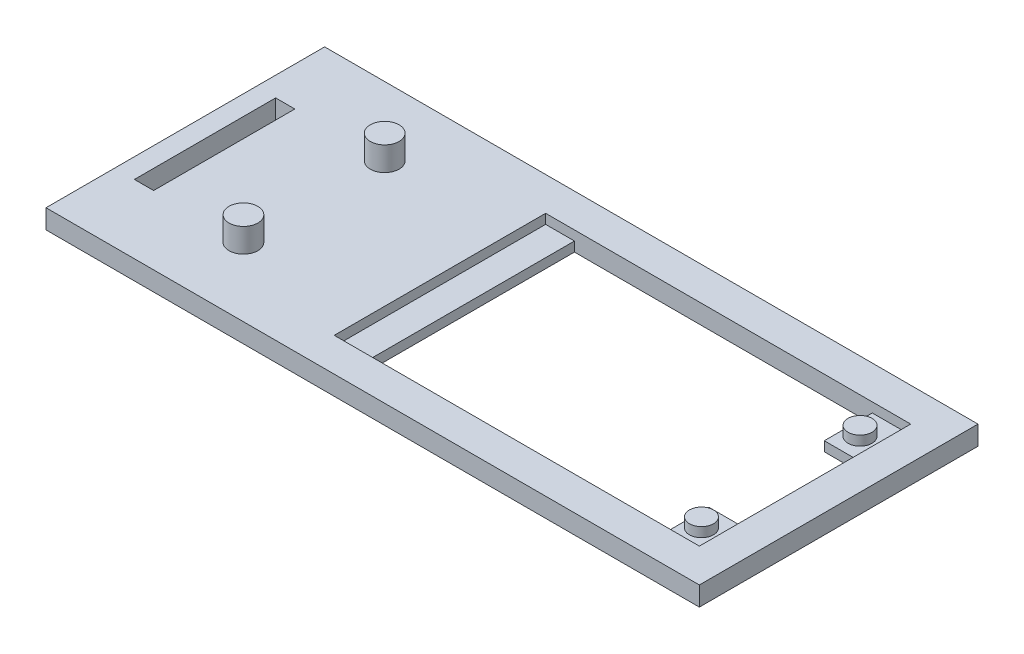
ISO-10303-21;
HEADER;
FILE_DESCRIPTION(('STEP AP214'),'2;1');
FILE_NAME('part.step','',(''),(''),'','','');
FILE_SCHEMA(('AUTOMOTIVE_DESIGN { 1 0 10303 214 1 1 1 1 }'));
ENDSEC;
DATA;
#1=APPLICATION_CONTEXT('core data for automotive mechanical design processes');
#2=APPLICATION_PROTOCOL_DEFINITION('international standard','automotive_design',2000,#1);
#3=PRODUCT_CONTEXT('',#1,'mechanical');
#4=PRODUCT('Part','Part','',(#3));
#5=PRODUCT_RELATED_PRODUCT_CATEGORY('part','',(#4));
#6=PRODUCT_DEFINITION_FORMATION('','',#4);
#7=PRODUCT_DEFINITION_CONTEXT('part definition',#1,'design');
#8=PRODUCT_DEFINITION('design','',#6,#7);
#9=PRODUCT_DEFINITION_SHAPE('','',#8);
#10=(LENGTH_UNIT() NAMED_UNIT(*) SI_UNIT(.MILLI.,.METRE.));
#11=(NAMED_UNIT(*) PLANE_ANGLE_UNIT() SI_UNIT($,.RADIAN.));
#12=(NAMED_UNIT(*) SI_UNIT($,.STERADIAN.) SOLID_ANGLE_UNIT());
#13=UNCERTAINTY_MEASURE_WITH_UNIT(LENGTH_MEASURE(1.E-05),#10,'distance_accuracy_value','');
#14=(GEOMETRIC_REPRESENTATION_CONTEXT(3) GLOBAL_UNCERTAINTY_ASSIGNED_CONTEXT((#13)) GLOBAL_UNIT_ASSIGNED_CONTEXT((#10,
#11,#12)) REPRESENTATION_CONTEXT('',''));
#15=CARTESIAN_POINT('',(0.,0.,0.));
#16=DIRECTION('',(0.,0.,1.));
#17=DIRECTION('',(1.,0.,0.));
#18=AXIS2_PLACEMENT_3D('',#15,#16,#17);
#19=CARTESIAN_POINT('',(0.,1.,0.));
#20=DIRECTION('',(0.,1.,0.));
#21=DIRECTION('',(0.,0.,1.));
#22=AXIS2_PLACEMENT_3D('',#19,#20,#21);
#23=PLANE('',#22);
#24=CARTESIAN_POINT('',(34.4148716728796,1.,-10.8055555555556));
#25=DIRECTION('',(0.,1.,0.));
#26=DIRECTION('',(0.,0.,1.));
#27=AXIS2_PLACEMENT_3D('',#24,#25,#26);
#28=CIRCLE('',#27,1.25);
#29=CARTESIAN_POINT('',(34.4148716728796,1.,-9.55555555555556));
#30=VERTEX_POINT('',#29);
#31=EDGE_CURVE('E199',#30,#30,#28,.T.);
#32=ORIENTED_EDGE('',*,*,#31,.F.);
#33=EDGE_LOOP('',(#32));
#34=FACE_BOUND('',#33,.T.);
#35=DIRECTION('',(-1.,0.,0.));
#36=VECTOR('',#35,1.);
#37=CARTESIAN_POINT('',(32.9444444444444,1.,-8.55555555555555));
#38=LINE('',#37,#36);
#39=CARTESIAN_POINT('',(36.9444444444444,1.,-8.55555555555555));
#40=VERTEX_POINT('',#39);
#41=CARTESIAN_POINT('',(32.9444444444444,1.,-8.55555555555555));
#42=VERTEX_POINT('',#41);
#43=EDGE_CURVE('E195',#40,#42,#38,.T.);
#44=ORIENTED_EDGE('',*,*,#43,.F.);
#45=DIRECTION('',(0.,0.,-1.));
#46=VECTOR('',#45,1.);
#47=CARTESIAN_POINT('',(36.9444444444444,1.,-13.5555555555556));
#48=LINE('',#47,#46);
#49=CARTESIAN_POINT('',(36.9444444444444,1.,-13.5555555555556));
#50=VERTEX_POINT('',#49);
#51=EDGE_CURVE('E243',#40,#50,#48,.T.);
#52=ORIENTED_EDGE('',*,*,#51,.T.);
#53=DIRECTION('',(-1.,0.,0.));
#54=VECTOR('',#53,1.);
#55=CARTESIAN_POINT('',(-1.05555555555555,1.,-13.5555555555556));
#56=LINE('',#55,#54);
#57=CARTESIAN_POINT('',(32.9444444444444,1.,-13.5555555555556));
#58=VERTEX_POINT('',#57);
#59=EDGE_CURVE('E247',#50,#58,#56,.T.);
#60=ORIENTED_EDGE('',*,*,#59,.T.);
#61=DIRECTION('',(0.,0.,-1.));
#62=VECTOR('',#61,1.);
#63=CARTESIAN_POINT('',(32.9444444444444,1.,-13.5555555555556));
#64=LINE('',#63,#62);
#65=EDGE_CURVE('E225',#42,#58,#64,.T.);
#66=ORIENTED_EDGE('',*,*,#65,.F.);
#67=EDGE_LOOP('',(#44,#52,#60,#66));
#68=FACE_BOUND('',#67,.T.);
#69=ADVANCED_FACE('F33',(#34,#68),#23,.T.);
#70=CARTESIAN_POINT('',(32.9444444444444,0.,-13.5555555555556));
#71=DIRECTION('',(1.,0.,0.));
#72=DIRECTION('',(0.,0.,-1.));
#73=AXIS2_PLACEMENT_3D('',#70,#71,#72);
#74=PLANE('',#73);
#75=DIRECTION('',(0.,0.,-1.));
#76=VECTOR('',#75,1.);
#77=CARTESIAN_POINT('',(32.9444444444444,0.,-13.5555555555556));
#78=LINE('',#77,#76);
#79=CARTESIAN_POINT('',(32.9444444444444,0.,-8.55555555555555));
#80=VERTEX_POINT('',#79);
#81=CARTESIAN_POINT('',(32.9444444444444,0.,-13.5555555555556));
#82=VERTEX_POINT('',#81);
#83=EDGE_CURVE('E217',#80,#82,#78,.T.);
#84=ORIENTED_EDGE('',*,*,#83,.F.);
#85=DIRECTION('',(0.,1.,0.));
#86=VECTOR('',#85,1.);
#87=CARTESIAN_POINT('',(32.9444444444444,0.,-8.55555555555555));
#88=LINE('',#87,#86);
#89=EDGE_CURVE('E205',#80,#42,#88,.T.);
#90=ORIENTED_EDGE('',*,*,#89,.T.);
#91=ORIENTED_EDGE('',*,*,#65,.T.);
#92=DIRECTION('',(0.,1.,0.));
#93=VECTOR('',#92,1.);
#94=CARTESIAN_POINT('',(32.9444444444444,0.,-13.5555555555556));
#95=LINE('',#94,#93);
#96=EDGE_CURVE('E230',#82,#58,#95,.T.);
#97=ORIENTED_EDGE('',*,*,#96,.F.);
#98=EDGE_LOOP('',(#84,#90,#91,#97));
#99=FACE_BOUND('',#98,.T.);
#100=ADVANCED_FACE('F368',(#99),#74,.F.);
#101=DIRECTION('',(0.,0.,1.));
#102=VECTOR('',#101,1.);
#103=CARTESIAN_POINT('',(1.94444444444445,1.,-13.5555555555556));
#104=LINE('',#103,#102);
#105=CARTESIAN_POINT('',(1.94444444444445,1.,-13.5555555555556));
#106=VERTEX_POINT('',#105);
#107=CARTESIAN_POINT('',(1.94444444444445,1.,8.44444444444444));
#108=VERTEX_POINT('',#107);
#109=EDGE_CURVE('E208',#106,#108,#104,.T.);
#110=ORIENTED_EDGE('',*,*,#109,.F.);
#111=CARTESIAN_POINT('',(-1.05555555555555,1.,-13.5555555555556));
#112=VERTEX_POINT('',#111);
#113=EDGE_CURVE('E246',#106,#112,#56,.T.);
#114=ORIENTED_EDGE('',*,*,#113,.T.);
#115=DIRECTION('',(0.,0.,1.));
#116=VECTOR('',#115,1.);
#117=CARTESIAN_POINT('',(-1.05555555555555,1.,-13.5555555555556));
#118=LINE('',#117,#116);
#119=CARTESIAN_POINT('',(-1.05555555555555,1.,8.44444444444444));
#120=VERTEX_POINT('',#119);
#121=EDGE_CURVE('E235',#112,#120,#118,.T.);
#122=ORIENTED_EDGE('',*,*,#121,.T.);
#123=DIRECTION('',(1.,0.,0.));
#124=VECTOR('',#123,1.);
#125=CARTESIAN_POINT('',(-1.05555555555555,1.,8.44444444444444));
#126=LINE('',#125,#124);
#127=EDGE_CURVE('E240',#120,#108,#126,.T.);
#128=ORIENTED_EDGE('',*,*,#127,.T.);
#129=EDGE_LOOP('',(#110,#114,#122,#128));
#130=FACE_BOUND('',#129,.T.);
#131=ADVANCED_FACE('F371',(#130),#23,.T.);
#132=CARTESIAN_POINT('',(-27.5555555555556,2.,-17.0555555555556));
#133=DIRECTION('',(1.,0.,0.));
#134=DIRECTION('',(0.,0.,-1.));
#135=AXIS2_PLACEMENT_3D('',#132,#133,#134);
#136=PLANE('',#135);
#137=DIRECTION('',(0.,0.,1.));
#138=VECTOR('',#137,1.);
#139=CARTESIAN_POINT('',(-27.5555555555556,0.,-17.0555555555556));
#140=LINE('',#139,#138);
#141=CARTESIAN_POINT('',(-27.5555555555556,0.,-17.0555555555556));
#142=VERTEX_POINT('',#141);
#143=CARTESIAN_POINT('',(-27.5555555555555,0.,11.9444444444444));
#144=VERTEX_POINT('',#143);
#145=EDGE_CURVE('E297',#142,#144,#140,.T.);
#146=ORIENTED_EDGE('',*,*,#145,.T.);
#147=DIRECTION('',(0.,-1.,0.));
#148=VECTOR('',#147,1.);
#149=CARTESIAN_POINT('',(-27.5555555555555,2.,11.9444444444444));
#150=LINE('',#149,#148);
#151=CARTESIAN_POINT('',(-27.5555555555555,2.,11.9444444444444));
#152=VERTEX_POINT('',#151);
#153=EDGE_CURVE('E326',#152,#144,#150,.T.);
#154=ORIENTED_EDGE('',*,*,#153,.F.);
#155=DIRECTION('',(0.,0.,1.));
#156=VECTOR('',#155,1.);
#157=CARTESIAN_POINT('',(-27.5555555555556,2.,-17.0555555555556));
#158=LINE('',#157,#156);
#159=CARTESIAN_POINT('',(-27.5555555555556,2.,-17.0555555555556));
#160=VERTEX_POINT('',#159);
#161=EDGE_CURVE('E300',#160,#152,#158,.T.);
#162=ORIENTED_EDGE('',*,*,#161,.F.);
#163=DIRECTION('',(0.,-1.,0.));
#164=VECTOR('',#163,1.);
#165=CARTESIAN_POINT('',(-27.5555555555556,2.,-17.0555555555556));
#166=LINE('',#165,#164);
#167=EDGE_CURVE('E310',#160,#142,#166,.T.);
#168=ORIENTED_EDGE('',*,*,#167,.T.);
#169=EDGE_LOOP('',(#146,#154,#162,#168));
#170=FACE_BOUND('',#169,.T.);
#171=ADVANCED_FACE('F35',(#170),#136,.F.);
#172=CARTESIAN_POINT('',(-27.5555555555555,2.,11.9444444444444));
#173=DIRECTION('',(0.,0.,-1.));
#174=DIRECTION('',(-1.,0.,0.));
#175=AXIS2_PLACEMENT_3D('',#172,#173,#174);
#176=PLANE('',#175);
#177=DIRECTION('',(1.,0.,0.));
#178=VECTOR('',#177,1.);
#179=CARTESIAN_POINT('',(-27.5555555555555,0.,11.9444444444444));
#180=LINE('',#179,#178);
#181=CARTESIAN_POINT('',(40.4444444444444,0.,11.9444444444444));
#182=VERTEX_POINT('',#181);
#183=EDGE_CURVE('E313',#144,#182,#180,.T.);
#184=ORIENTED_EDGE('',*,*,#183,.T.);
#185=DIRECTION('',(0.,-1.,0.));
#186=VECTOR('',#185,1.);
#187=CARTESIAN_POINT('',(40.4444444444444,2.,11.9444444444444));
#188=LINE('',#187,#186);
#189=CARTESIAN_POINT('',(40.4444444444444,2.,11.9444444444444));
#190=VERTEX_POINT('',#189);
#191=EDGE_CURVE('E323',#190,#182,#188,.T.);
#192=ORIENTED_EDGE('',*,*,#191,.F.);
#193=DIRECTION('',(1.,0.,0.));
#194=VECTOR('',#193,1.);
#195=CARTESIAN_POINT('',(-27.5555555555555,2.,11.9444444444444));
#196=LINE('',#195,#194);
#197=EDGE_CURVE('E303',#152,#190,#196,.T.);
#198=ORIENTED_EDGE('',*,*,#197,.F.);
#199=ORIENTED_EDGE('',*,*,#153,.T.);
#200=EDGE_LOOP('',(#184,#192,#198,#199));
#201=FACE_BOUND('',#200,.T.);
#202=ADVANCED_FACE('F641',(#201),#176,.F.);
#203=CARTESIAN_POINT('',(40.4444444444445,2.,-17.0555555555556));
#204=DIRECTION('',(-1.,0.,0.));
#205=DIRECTION('',(0.,0.,1.));
#206=AXIS2_PLACEMENT_3D('',#203,#204,#205);
#207=PLANE('',#206);
#208=DIRECTION('',(0.,0.,-1.));
#209=VECTOR('',#208,1.);
#210=CARTESIAN_POINT('',(40.4444444444445,0.,-17.0555555555556));
#211=LINE('',#210,#209);
#212=CARTESIAN_POINT('',(40.4444444444445,0.,-17.0555555555556));
#213=VERTEX_POINT('',#212);
#214=EDGE_CURVE('E315',#182,#213,#211,.T.);
#215=ORIENTED_EDGE('',*,*,#214,.T.);
#216=DIRECTION('',(0.,-1.,0.));
#217=VECTOR('',#216,1.);
#218=CARTESIAN_POINT('',(40.4444444444445,2.,-17.0555555555556));
#219=LINE('',#218,#217);
#220=CARTESIAN_POINT('',(40.4444444444445,2.,-17.0555555555556));
#221=VERTEX_POINT('',#220);
#222=EDGE_CURVE('E320',#221,#213,#219,.T.);
#223=ORIENTED_EDGE('',*,*,#222,.F.);
#224=DIRECTION('',(0.,0.,-1.));
#225=VECTOR('',#224,1.);
#226=CARTESIAN_POINT('',(40.4444444444445,2.,-17.0555555555556));
#227=LINE('',#226,#225);
#228=EDGE_CURVE('E306',#190,#221,#227,.T.);
#229=ORIENTED_EDGE('',*,*,#228,.F.);
#230=ORIENTED_EDGE('',*,*,#191,.T.);
#231=EDGE_LOOP('',(#215,#223,#229,#230));
#232=FACE_BOUND('',#231,.T.);
#233=ADVANCED_FACE('F631',(#232),#207,.F.);
#234=CARTESIAN_POINT('',(-27.5555555555556,2.,-17.0555555555556));
#235=DIRECTION('',(0.,0.,1.));
#236=DIRECTION('',(1.,0.,0.));
#237=AXIS2_PLACEMENT_3D('',#234,#235,#236);
#238=PLANE('',#237);
#239=DIRECTION('',(-1.,0.,0.));
#240=VECTOR('',#239,1.);
#241=CARTESIAN_POINT('',(-27.5555555555556,0.,-17.0555555555556));
#242=LINE('',#241,#240);
#243=EDGE_CURVE('E304',#213,#142,#242,.T.);
#244=ORIENTED_EDGE('',*,*,#243,.T.);
#245=ORIENTED_EDGE('',*,*,#167,.F.);
#246=DIRECTION('',(-1.,0.,0.));
#247=VECTOR('',#246,1.);
#248=CARTESIAN_POINT('',(-27.5555555555556,2.,-17.0555555555556));
#249=LINE('',#248,#247);
#250=EDGE_CURVE('E308',#221,#160,#249,.T.);
#251=ORIENTED_EDGE('',*,*,#250,.F.);
#252=ORIENTED_EDGE('',*,*,#222,.T.);
#253=EDGE_LOOP('',(#244,#245,#251,#252));
#254=FACE_BOUND('',#253,.T.);
#255=ADVANCED_FACE('F560',(#254),#238,.F.);
#256=CARTESIAN_POINT('',(0.,2.,0.));
#257=DIRECTION('',(0.,1.,0.));
#258=DIRECTION('',(0.,0.,1.));
#259=AXIS2_PLACEMENT_3D('',#256,#257,#258);
#260=PLANE('',#259);
#261=DIRECTION('',(0.,0.,1.));
#262=VECTOR('',#261,1.);
#263=CARTESIAN_POINT('',(-1.05555555555555,2.,-13.5555555555556));
#264=LINE('',#263,#262);
#265=CARTESIAN_POINT('',(-1.05555555555555,2.,-13.5555555555556));
#266=VERTEX_POINT('',#265);
#267=CARTESIAN_POINT('',(-1.05555555555555,2.,8.44444444444444));
#268=VERTEX_POINT('',#267);
#269=EDGE_CURVE('E229',#266,#268,#264,.T.);
#270=ORIENTED_EDGE('',*,*,#269,.F.);
#271=DIRECTION('',(-1.,0.,0.));
#272=VECTOR('',#271,1.);
#273=CARTESIAN_POINT('',(-1.05555555555555,2.,-13.5555555555556));
#274=LINE('',#273,#272);
#275=CARTESIAN_POINT('',(36.9444444444444,2.,-13.5555555555556));
#276=VERTEX_POINT('',#275);
#277=EDGE_CURVE('E239',#276,#266,#274,.T.);
#278=ORIENTED_EDGE('',*,*,#277,.F.);
#279=DIRECTION('',(0.,0.,-1.));
#280=VECTOR('',#279,1.);
#281=CARTESIAN_POINT('',(36.9444444444444,2.,-13.5555555555556));
#282=LINE('',#281,#280);
#283=CARTESIAN_POINT('',(36.9444444444444,2.,8.44444444444444));
#284=VERTEX_POINT('',#283);
#285=EDGE_CURVE('E255',#284,#276,#282,.T.);
#286=ORIENTED_EDGE('',*,*,#285,.F.);
#287=DIRECTION('',(1.,0.,0.));
#288=VECTOR('',#287,1.);
#289=CARTESIAN_POINT('',(-1.05555555555555,2.,8.44444444444444));
#290=LINE('',#289,#288);
#291=EDGE_CURVE('E252',#268,#284,#290,.T.);
#292=ORIENTED_EDGE('',*,*,#291,.F.);
#293=EDGE_LOOP('',(#270,#278,#286,#292));
#294=FACE_BOUND('',#293,.T.);
#295=DIRECTION('',(0.,0.,1.));
#296=VECTOR('',#295,1.);
#297=CARTESIAN_POINT('',(-25.5055555555555,2.,-9.90555555555555));
#298=LINE('',#297,#296);
#299=CARTESIAN_POINT('',(-25.5055555555555,2.,-9.90555555555555));
#300=VERTEX_POINT('',#299);
#301=CARTESIAN_POINT('',(-25.5055555555555,2.,4.79444444444445));
#302=VERTEX_POINT('',#301);
#303=EDGE_CURVE('E261',#300,#302,#298,.T.);
#304=ORIENTED_EDGE('',*,*,#303,.F.);
#305=DIRECTION('',(-1.,0.,0.));
#306=VECTOR('',#305,1.);
#307=CARTESIAN_POINT('',(-25.5055555555555,2.,-9.90555555555555));
#308=LINE('',#307,#306);
#309=CARTESIAN_POINT('',(-23.5055555555555,2.,-9.90555555555555));
#310=VERTEX_POINT('',#309);
#311=EDGE_CURVE('E275',#310,#300,#308,.T.);
#312=ORIENTED_EDGE('',*,*,#311,.F.);
#313=DIRECTION('',(0.,0.,-1.));
#314=VECTOR('',#313,1.);
#315=CARTESIAN_POINT('',(-23.5055555555555,2.,-9.90555555555555));
#316=LINE('',#315,#314);
#317=CARTESIAN_POINT('',(-23.5055555555555,2.,4.79444444444445));
#318=VERTEX_POINT('',#317);
#319=EDGE_CURVE('E272',#318,#310,#316,.T.);
#320=ORIENTED_EDGE('',*,*,#319,.F.);
#321=DIRECTION('',(1.,0.,0.));
#322=VECTOR('',#321,1.);
#323=CARTESIAN_POINT('',(-25.5055555555555,2.,4.79444444444445));
#324=LINE('',#323,#322);
#325=EDGE_CURVE('E269',#302,#318,#324,.T.);
#326=ORIENTED_EDGE('',*,*,#325,.F.);
#327=EDGE_LOOP('',(#304,#312,#320,#326));
#328=FACE_BOUND('',#327,.T.);
#329=CARTESIAN_POINT('',(-14.1555555555555,2.,-9.90555555555555));
#330=DIRECTION('',(0.,1.,0.));
#331=DIRECTION('',(0.,0.,1.));
#332=AXIS2_PLACEMENT_3D('',#329,#330,#331);
#333=CIRCLE('',#332,1.5);
#334=CARTESIAN_POINT('',(-14.1555555555555,2.,-8.40555555555555));
#335=VERTEX_POINT('',#334);
#336=EDGE_CURVE('E281',#335,#335,#333,.T.);
#337=ORIENTED_EDGE('',*,*,#336,.F.);
#338=EDGE_LOOP('',(#337));
#339=FACE_BOUND('',#338,.T.);
#340=CARTESIAN_POINT('',(-14.1555555555555,2.,4.79444444444445));
#341=DIRECTION('',(0.,1.,0.));
#342=DIRECTION('',(0.,0.,1.));
#343=AXIS2_PLACEMENT_3D('',#340,#341,#342);
#344=CIRCLE('',#343,1.5);
#345=CARTESIAN_POINT('',(-14.1555555555555,2.,6.29444444444445));
#346=VERTEX_POINT('',#345);
#347=EDGE_CURVE('E291',#346,#346,#344,.T.);
#348=ORIENTED_EDGE('',*,*,#347,.F.);
#349=EDGE_LOOP('',(#348));
#350=FACE_BOUND('',#349,.T.);
#351=ORIENTED_EDGE('',*,*,#161,.T.);
#352=ORIENTED_EDGE('',*,*,#197,.T.);
#353=ORIENTED_EDGE('',*,*,#228,.T.);
#354=ORIENTED_EDGE('',*,*,#250,.T.);
#355=EDGE_LOOP('',(#351,#352,#353,#354));
#356=FACE_BOUND('',#355,.T.);
#357=ADVANCED_FACE('F348',(#294,#328,#339,#350,#356),#260,.T.);
#358=CARTESIAN_POINT('',(0.,0.,0.));
#359=DIRECTION('',(0.,1.,0.));
#360=DIRECTION('',(0.,0.,1.));
#361=AXIS2_PLACEMENT_3D('',#358,#359,#360);
#362=PLANE('',#361);
#363=DIRECTION('',(0.,0.,-1.));
#364=VECTOR('',#363,1.);
#365=CARTESIAN_POINT('',(36.9444444444444,0.,-8.55555555555555));
#366=LINE('',#365,#364);
#367=CARTESIAN_POINT('',(36.9444444444444,0.,3.44444444444445));
#368=VERTEX_POINT('',#367);
#369=CARTESIAN_POINT('',(36.9444444444444,0.,-8.55555555555555));
#370=VERTEX_POINT('',#369);
#371=EDGE_CURVE('E181',#368,#370,#366,.T.);
#372=ORIENTED_EDGE('',*,*,#371,.T.);
#373=DIRECTION('',(-1.,0.,0.));
#374=VECTOR('',#373,1.);
#375=CARTESIAN_POINT('',(32.9444444444444,0.,-8.55555555555555));
#376=LINE('',#375,#374);
#377=EDGE_CURVE('E188',#370,#80,#376,.T.);
#378=ORIENTED_EDGE('',*,*,#377,.T.);
#379=ORIENTED_EDGE('',*,*,#83,.T.);
#380=DIRECTION('',(-1.,0.,0.));
#381=VECTOR('',#380,1.);
#382=CARTESIAN_POINT('',(1.94444444444445,0.,-13.5555555555556));
#383=LINE('',#382,#381);
#384=CARTESIAN_POINT('',(1.94444444444445,0.,-13.5555555555556));
#385=VERTEX_POINT('',#384);
#386=EDGE_CURVE('E219',#82,#385,#383,.T.);
#387=ORIENTED_EDGE('',*,*,#386,.T.);
#388=DIRECTION('',(0.,0.,1.));
#389=VECTOR('',#388,1.);
#390=CARTESIAN_POINT('',(1.94444444444445,0.,-13.5555555555556));
#391=LINE('',#390,#389);
#392=CARTESIAN_POINT('',(1.94444444444445,0.,8.44444444444444));
#393=VERTEX_POINT('',#392);
#394=EDGE_CURVE('E211',#385,#393,#391,.T.);
#395=ORIENTED_EDGE('',*,*,#394,.T.);
#396=DIRECTION('',(1.,0.,0.));
#397=VECTOR('',#396,1.);
#398=CARTESIAN_POINT('',(1.94444444444445,0.,8.44444444444444));
#399=LINE('',#398,#397);
#400=CARTESIAN_POINT('',(32.9444444444444,0.,8.44444444444444));
#401=VERTEX_POINT('',#400);
#402=EDGE_CURVE('E214',#393,#401,#399,.T.);
#403=ORIENTED_EDGE('',*,*,#402,.T.);
#404=CARTESIAN_POINT('',(32.9444444444444,0.,3.44444444444444));
#405=VERTEX_POINT('',#404);
#406=EDGE_CURVE('E194',#401,#405,#78,.T.);
#407=ORIENTED_EDGE('',*,*,#406,.T.);
#408=DIRECTION('',(1.,0.,0.));
#409=VECTOR('',#408,1.);
#410=CARTESIAN_POINT('',(32.9444444444444,0.,3.44444444444445));
#411=LINE('',#410,#409);
#412=EDGE_CURVE('E48',#405,#368,#411,.T.);
#413=ORIENTED_EDGE('',*,*,#412,.T.);
#414=EDGE_LOOP('',(#372,#378,#379,#387,#395,#403,#407,#413));
#415=FACE_BOUND('',#414,.T.);
#416=DIRECTION('',(-1.,0.,0.));
#417=VECTOR('',#416,1.);
#418=CARTESIAN_POINT('',(0.,0.,-9.90555555555555));
#419=LINE('',#418,#417);
#420=CARTESIAN_POINT('',(-23.5055555555555,0.,-9.90555555555555));
#421=VERTEX_POINT('',#420);
#422=CARTESIAN_POINT('',(-25.5055555555555,0.,-9.90555555555555));
#423=VERTEX_POINT('',#422);
#424=EDGE_CURVE('E41',#421,#423,#419,.T.);
#425=ORIENTED_EDGE('',*,*,#424,.T.);
#426=DIRECTION('',(0.,0.,1.));
#427=VECTOR('',#426,1.);
#428=CARTESIAN_POINT('',(-25.5055555555555,0.,0.));
#429=LINE('',#428,#427);
#430=CARTESIAN_POINT('',(-25.5055555555555,0.,4.79444444444445));
#431=VERTEX_POINT('',#430);
#432=EDGE_CURVE('E11',#423,#431,#429,.T.);
#433=ORIENTED_EDGE('',*,*,#432,.T.);
#434=DIRECTION('',(1.,0.,0.));
#435=VECTOR('',#434,1.);
#436=CARTESIAN_POINT('',(0.,0.,4.79444444444445));
#437=LINE('',#436,#435);
#438=CARTESIAN_POINT('',(-23.5055555555555,0.,4.79444444444445));
#439=VERTEX_POINT('',#438);
#440=EDGE_CURVE('E329',#431,#439,#437,.T.);
#441=ORIENTED_EDGE('',*,*,#440,.T.);
#442=DIRECTION('',(0.,0.,-1.));
#443=VECTOR('',#442,1.);
#444=CARTESIAN_POINT('',(-23.5055555555555,0.,0.));
#445=LINE('',#444,#443);
#446=EDGE_CURVE('E332',#439,#421,#445,.T.);
#447=ORIENTED_EDGE('',*,*,#446,.T.);
#448=EDGE_LOOP('',(#425,#433,#441,#447));
#449=FACE_BOUND('',#448,.T.);
#450=ORIENTED_EDGE('',*,*,#145,.F.);
#451=ORIENTED_EDGE('',*,*,#243,.F.);
#452=ORIENTED_EDGE('',*,*,#214,.F.);
#453=ORIENTED_EDGE('',*,*,#183,.F.);
#454=EDGE_LOOP('',(#450,#451,#452,#453));
#455=FACE_BOUND('',#454,.T.);
#456=ADVANCED_FACE('F191',(#415,#449,#455),#362,.F.);
#457=CARTESIAN_POINT('',(-14.1555555555555,4.5,4.79444444444445));
#458=DIRECTION('',(0.,-1.,0.));
#459=DIRECTION('',(0.,0.,-1.));
#460=AXIS2_PLACEMENT_3D('',#457,#458,#459);
#461=CYLINDRICAL_SURFACE('',#460,1.5);
#462=CARTESIAN_POINT('',(-14.1555555555555,4.5,4.79444444444445));
#463=DIRECTION('',(0.,1.,0.));
#464=DIRECTION('',(0.,0.,1.));
#465=AXIS2_PLACEMENT_3D('',#462,#463,#464);
#466=CIRCLE('',#465,1.5);
#467=CARTESIAN_POINT('',(-14.1555555555555,4.5,6.29444444444445));
#468=VERTEX_POINT('',#467);
#469=EDGE_CURVE('E294',#468,#468,#466,.T.);
#470=ORIENTED_EDGE('',*,*,#469,.F.);
#471=EDGE_LOOP('',(#470));
#472=FACE_BOUND('',#471,.T.);
#473=ORIENTED_EDGE('',*,*,#347,.T.);
#474=EDGE_LOOP('',(#473));
#475=FACE_BOUND('',#474,.T.);
#476=ADVANCED_FACE('F536',(#472,#475),#461,.T.);
#477=CARTESIAN_POINT('',(-14.1555555555555,4.5,4.79444444444445));
#478=DIRECTION('',(0.,1.,0.));
#479=DIRECTION('',(0.,0.,1.));
#480=AXIS2_PLACEMENT_3D('',#477,#478,#479);
#481=PLANE('',#480);
#482=ORIENTED_EDGE('',*,*,#469,.T.);
#483=EDGE_LOOP('',(#482));
#484=FACE_BOUND('',#483,.T.);
#485=ADVANCED_FACE('F607',(#484),#481,.T.);
#486=CARTESIAN_POINT('',(-14.1555555555555,4.5,-9.90555555555555));
#487=DIRECTION('',(0.,-1.,0.));
#488=DIRECTION('',(0.,0.,-1.));
#489=AXIS2_PLACEMENT_3D('',#486,#487,#488);
#490=CYLINDRICAL_SURFACE('',#489,1.5);
#491=CARTESIAN_POINT('',(-14.1555555555555,4.5,-9.90555555555555));
#492=DIRECTION('',(0.,1.,0.));
#493=DIRECTION('',(0.,0.,1.));
#494=AXIS2_PLACEMENT_3D('',#491,#492,#493);
#495=CIRCLE('',#494,1.5);
#496=CARTESIAN_POINT('',(-14.1555555555555,4.5,-8.40555555555555));
#497=VERTEX_POINT('',#496);
#498=EDGE_CURVE('E288',#497,#497,#495,.T.);
#499=ORIENTED_EDGE('',*,*,#498,.F.);
#500=EDGE_LOOP('',(#499));
#501=FACE_BOUND('',#500,.T.);
#502=ORIENTED_EDGE('',*,*,#336,.T.);
#503=EDGE_LOOP('',(#502));
#504=FACE_BOUND('',#503,.T.);
#505=ADVANCED_FACE('F597',(#501,#504),#490,.T.);
#506=CARTESIAN_POINT('',(-14.1555555555555,4.5,-9.90555555555555));
#507=DIRECTION('',(0.,1.,0.));
#508=DIRECTION('',(0.,0.,1.));
#509=AXIS2_PLACEMENT_3D('',#506,#507,#508);
#510=PLANE('',#509);
#511=ORIENTED_EDGE('',*,*,#498,.T.);
#512=EDGE_LOOP('',(#511));
#513=FACE_BOUND('',#512,.T.);
#514=ADVANCED_FACE('F589',(#513),#510,.T.);
#515=CARTESIAN_POINT('',(-25.5055555555555,-0.5,-9.90555555555555));
#516=DIRECTION('',(-1.,0.,0.));
#517=DIRECTION('',(0.,0.,1.));
#518=AXIS2_PLACEMENT_3D('',#515,#516,#517);
#519=PLANE('',#518);
#520=DIRECTION('',(0.,1.,0.));
#521=VECTOR('',#520,1.);
#522=CARTESIAN_POINT('',(-25.5055555555555,-0.5,-9.90555555555555));
#523=LINE('',#522,#521);
#524=EDGE_CURVE('E279',#423,#300,#523,.T.);
#525=ORIENTED_EDGE('',*,*,#524,.T.);
#526=ORIENTED_EDGE('',*,*,#303,.T.);
#527=DIRECTION('',(0.,1.,0.));
#528=VECTOR('',#527,1.);
#529=CARTESIAN_POINT('',(-25.5055555555555,-0.5,4.79444444444445));
#530=LINE('',#529,#528);
#531=EDGE_CURVE('E278',#431,#302,#530,.T.);
#532=ORIENTED_EDGE('',*,*,#531,.F.);
#533=ORIENTED_EDGE('',*,*,#432,.F.);
#534=EDGE_LOOP('',(#525,#526,#532,#533));
#535=FACE_BOUND('',#534,.T.);
#536=ADVANCED_FACE('F352',(#535),#519,.F.);
#537=CARTESIAN_POINT('',(-25.5055555555555,-0.5,-9.90555555555555));
#538=DIRECTION('',(0.,0.,-1.));
#539=DIRECTION('',(-1.,0.,0.));
#540=AXIS2_PLACEMENT_3D('',#537,#538,#539);
#541=PLANE('',#540);
#542=DIRECTION('',(0.,1.,0.));
#543=VECTOR('',#542,1.);
#544=CARTESIAN_POINT('',(-23.5055555555555,-0.5,-9.90555555555555));
#545=LINE('',#544,#543);
#546=EDGE_CURVE('E282',#421,#310,#545,.T.);
#547=ORIENTED_EDGE('',*,*,#546,.T.);
#548=ORIENTED_EDGE('',*,*,#311,.T.);
#549=ORIENTED_EDGE('',*,*,#524,.F.);
#550=ORIENTED_EDGE('',*,*,#424,.F.);
#551=EDGE_LOOP('',(#547,#548,#549,#550));
#552=FACE_BOUND('',#551,.T.);
#553=ADVANCED_FACE('F340',(#552),#541,.F.);
#554=CARTESIAN_POINT('',(-23.5055555555555,-0.5,-9.90555555555555));
#555=DIRECTION('',(1.,0.,0.));
#556=DIRECTION('',(0.,0.,-1.));
#557=AXIS2_PLACEMENT_3D('',#554,#555,#556);
#558=PLANE('',#557);
#559=DIRECTION('',(0.,1.,0.));
#560=VECTOR('',#559,1.);
#561=CARTESIAN_POINT('',(-23.5055555555555,-0.5,4.79444444444445));
#562=LINE('',#561,#560);
#563=EDGE_CURVE('E284',#439,#318,#562,.T.);
#564=ORIENTED_EDGE('',*,*,#563,.T.);
#565=ORIENTED_EDGE('',*,*,#319,.T.);
#566=ORIENTED_EDGE('',*,*,#546,.F.);
#567=ORIENTED_EDGE('',*,*,#446,.F.);
#568=EDGE_LOOP('',(#564,#565,#566,#567));
#569=FACE_BOUND('',#568,.T.);
#570=ADVANCED_FACE('F342',(#569),#558,.F.);
#571=CARTESIAN_POINT('',(-25.5055555555555,-0.5,4.79444444444445));
#572=DIRECTION('',(0.,0.,1.));
#573=DIRECTION('',(1.,0.,0.));
#574=AXIS2_PLACEMENT_3D('',#571,#572,#573);
#575=PLANE('',#574);
#576=ORIENTED_EDGE('',*,*,#531,.T.);
#577=ORIENTED_EDGE('',*,*,#325,.T.);
#578=ORIENTED_EDGE('',*,*,#563,.F.);
#579=ORIENTED_EDGE('',*,*,#440,.F.);
#580=EDGE_LOOP('',(#576,#577,#578,#579));
#581=FACE_BOUND('',#580,.T.);
#582=ADVANCED_FACE('F354',(#581),#575,.F.);
#583=CARTESIAN_POINT('',(-1.05555555555555,1.,-13.5555555555556));
#584=DIRECTION('',(-1.,0.,0.));
#585=DIRECTION('',(0.,0.,1.));
#586=AXIS2_PLACEMENT_3D('',#583,#584,#585);
#587=PLANE('',#586);
#588=ORIENTED_EDGE('',*,*,#269,.T.);
#589=DIRECTION('',(0.,1.,0.));
#590=VECTOR('',#589,1.);
#591=CARTESIAN_POINT('',(-1.05555555555555,1.,8.44444444444444));
#592=LINE('',#591,#590);
#593=EDGE_CURVE('E250',#120,#268,#592,.T.);
#594=ORIENTED_EDGE('',*,*,#593,.F.);
#595=ORIENTED_EDGE('',*,*,#121,.F.);
#596=DIRECTION('',(0.,1.,0.));
#597=VECTOR('',#596,1.);
#598=CARTESIAN_POINT('',(-1.05555555555555,1.,-13.5555555555556));
#599=LINE('',#598,#597);
#600=EDGE_CURVE('E259',#112,#266,#599,.T.);
#601=ORIENTED_EDGE('',*,*,#600,.T.);
#602=EDGE_LOOP('',(#588,#594,#595,#601));
#603=FACE_BOUND('',#602,.T.);
#604=ADVANCED_FACE('F356',(#603),#587,.F.);
#605=CARTESIAN_POINT('',(-1.05555555555555,1.,-13.5555555555556));
#606=DIRECTION('',(0.,0.,-1.));
#607=DIRECTION('',(-1.,0.,0.));
#608=AXIS2_PLACEMENT_3D('',#605,#606,#607);
#609=PLANE('',#608);
#610=ORIENTED_EDGE('',*,*,#277,.T.);
#611=ORIENTED_EDGE('',*,*,#600,.F.);
#612=ORIENTED_EDGE('',*,*,#113,.F.);
#613=DIRECTION('',(0.,1.,0.));
#614=VECTOR('',#613,1.);
#615=CARTESIAN_POINT('',(1.94444444444445,0.,-13.5555555555556));
#616=LINE('',#615,#614);
#617=EDGE_CURVE('E227',#385,#106,#616,.T.);
#618=ORIENTED_EDGE('',*,*,#617,.F.);
#619=ORIENTED_EDGE('',*,*,#386,.F.);
#620=ORIENTED_EDGE('',*,*,#96,.T.);
#621=ORIENTED_EDGE('',*,*,#59,.F.);
#622=DIRECTION('',(0.,1.,0.));
#623=VECTOR('',#622,1.);
#624=CARTESIAN_POINT('',(36.9444444444444,1.,-13.5555555555556));
#625=LINE('',#624,#623);
#626=EDGE_CURVE('E262',#50,#276,#625,.T.);
#627=ORIENTED_EDGE('',*,*,#626,.T.);
#628=EDGE_LOOP('',(#610,#611,#612,#618,#619,#620,#621,#627));
#629=FACE_BOUND('',#628,.T.);
#630=ADVANCED_FACE('F362',(#629),#609,.F.);
#631=CARTESIAN_POINT('',(36.9444444444444,1.,-13.5555555555556));
#632=DIRECTION('',(1.,0.,0.));
#633=DIRECTION('',(0.,0.,-1.));
#634=AXIS2_PLACEMENT_3D('',#631,#632,#633);
#635=PLANE('',#634);
#636=ORIENTED_EDGE('',*,*,#285,.T.);
#637=ORIENTED_EDGE('',*,*,#626,.F.);
#638=ORIENTED_EDGE('',*,*,#51,.F.);
#639=DIRECTION('',(0.,1.,0.));
#640=VECTOR('',#639,1.);
#641=CARTESIAN_POINT('',(36.9444444444444,0.,-8.55555555555555));
#642=LINE('',#641,#640);
#643=EDGE_CURVE('E177',#370,#40,#642,.T.);
#644=ORIENTED_EDGE('',*,*,#643,.F.);
#645=ORIENTED_EDGE('',*,*,#371,.F.);
#646=DIRECTION('',(0.,1.,0.));
#647=VECTOR('',#646,1.);
#648=CARTESIAN_POINT('',(36.9444444444444,0.,3.44444444444445));
#649=LINE('',#648,#647);
#650=CARTESIAN_POINT('',(36.9444444444444,1.,3.44444444444445));
#651=VERTEX_POINT('',#650);
#652=EDGE_CURVE('E169',#368,#651,#649,.T.);
#653=ORIENTED_EDGE('',*,*,#652,.T.);
#654=CARTESIAN_POINT('',(36.9444444444444,1.,8.44444444444444));
#655=VERTEX_POINT('',#654);
#656=EDGE_CURVE('E244',#655,#651,#48,.T.);
#657=ORIENTED_EDGE('',*,*,#656,.F.);
#658=DIRECTION('',(0.,1.,0.));
#659=VECTOR('',#658,1.);
#660=CARTESIAN_POINT('',(36.9444444444444,1.,8.44444444444444));
#661=LINE('',#660,#659);
#662=EDGE_CURVE('E264',#655,#284,#661,.T.);
#663=ORIENTED_EDGE('',*,*,#662,.T.);
#664=EDGE_LOOP('',(#636,#637,#638,#644,#645,#653,#657,#663));
#665=FACE_BOUND('',#664,.T.);
#666=ADVANCED_FACE('F183',(#665),#635,.F.);
#667=CARTESIAN_POINT('',(-1.05555555555555,1.,8.44444444444444));
#668=DIRECTION('',(0.,0.,1.));
#669=DIRECTION('',(1.,0.,0.));
#670=AXIS2_PLACEMENT_3D('',#667,#668,#669);
#671=PLANE('',#670);
#672=ORIENTED_EDGE('',*,*,#291,.T.);
#673=ORIENTED_EDGE('',*,*,#662,.F.);
#674=CARTESIAN_POINT('',(32.9444444444444,1.,8.44444444444444));
#675=VERTEX_POINT('',#674);
#676=EDGE_CURVE('E238',#675,#655,#126,.T.);
#677=ORIENTED_EDGE('',*,*,#676,.F.);
#678=DIRECTION('',(0.,1.,0.));
#679=VECTOR('',#678,1.);
#680=CARTESIAN_POINT('',(32.9444444444444,0.,8.44444444444444));
#681=LINE('',#680,#679);
#682=EDGE_CURVE('E56',#401,#675,#681,.T.);
#683=ORIENTED_EDGE('',*,*,#682,.F.);
#684=ORIENTED_EDGE('',*,*,#402,.F.);
#685=DIRECTION('',(0.,1.,0.));
#686=VECTOR('',#685,1.);
#687=CARTESIAN_POINT('',(1.94444444444445,0.,8.44444444444444));
#688=LINE('',#687,#686);
#689=EDGE_CURVE('E222',#393,#108,#688,.T.);
#690=ORIENTED_EDGE('',*,*,#689,.T.);
#691=ORIENTED_EDGE('',*,*,#127,.F.);
#692=ORIENTED_EDGE('',*,*,#593,.T.);
#693=EDGE_LOOP('',(#672,#673,#677,#683,#684,#690,#691,#692));
#694=FACE_BOUND('',#693,.T.);
#695=ADVANCED_FACE('F387',(#694),#671,.F.);
#696=CARTESIAN_POINT('',(34.4148716728796,1.,5.69444444444445));
#697=DIRECTION('',(0.,1.,0.));
#698=DIRECTION('',(0.,0.,1.));
#699=AXIS2_PLACEMENT_3D('',#696,#697,#698);
#700=CIRCLE('',#699,1.25);
#701=CARTESIAN_POINT('',(34.4148716728796,1.,6.94444444444444));
#702=VERTEX_POINT('',#701);
#703=EDGE_CURVE('E399',#702,#702,#700,.T.);
#704=ORIENTED_EDGE('',*,*,#703,.F.);
#705=EDGE_LOOP('',(#704));
#706=FACE_BOUND('',#705,.T.);
#707=DIRECTION('',(1.,0.,0.));
#708=VECTOR('',#707,1.);
#709=CARTESIAN_POINT('',(32.9444444444444,1.,3.44444444444445));
#710=LINE('',#709,#708);
#711=CARTESIAN_POINT('',(32.9444444444444,1.,3.44444444444445));
#712=VERTEX_POINT('',#711);
#713=EDGE_CURVE('E173',#712,#651,#710,.T.);
#714=ORIENTED_EDGE('',*,*,#713,.F.);
#715=EDGE_CURVE('E215',#675,#712,#64,.T.);
#716=ORIENTED_EDGE('',*,*,#715,.F.);
#717=ORIENTED_EDGE('',*,*,#676,.T.);
#718=ORIENTED_EDGE('',*,*,#656,.T.);
#719=EDGE_LOOP('',(#714,#716,#717,#718));
#720=FACE_BOUND('',#719,.T.);
#721=ADVANCED_FACE('F372',(#706,#720),#23,.T.);
#722=CARTESIAN_POINT('',(1.94444444444445,0.,-13.5555555555556));
#723=DIRECTION('',(-1.,0.,0.));
#724=DIRECTION('',(0.,0.,1.));
#725=AXIS2_PLACEMENT_3D('',#722,#723,#724);
#726=PLANE('',#725);
#727=ORIENTED_EDGE('',*,*,#109,.T.);
#728=ORIENTED_EDGE('',*,*,#689,.F.);
#729=ORIENTED_EDGE('',*,*,#394,.F.);
#730=ORIENTED_EDGE('',*,*,#617,.T.);
#731=EDGE_LOOP('',(#727,#728,#729,#730));
#732=FACE_BOUND('',#731,.T.);
#733=ADVANCED_FACE('F386',(#732),#726,.F.);
#734=ORIENTED_EDGE('',*,*,#715,.T.);
#735=DIRECTION('',(0.,1.,0.));
#736=VECTOR('',#735,1.);
#737=CARTESIAN_POINT('',(32.9444444444444,0.,3.44444444444445));
#738=LINE('',#737,#736);
#739=EDGE_CURVE('E178',#405,#712,#738,.T.);
#740=ORIENTED_EDGE('',*,*,#739,.F.);
#741=ORIENTED_EDGE('',*,*,#406,.F.);
#742=ORIENTED_EDGE('',*,*,#682,.T.);
#743=EDGE_LOOP('',(#734,#740,#741,#742));
#744=FACE_BOUND('',#743,.T.);
#745=ADVANCED_FACE('F378',(#744),#74,.F.);
#746=CARTESIAN_POINT('',(32.9444444444444,0.,-8.55555555555555));
#747=DIRECTION('',(0.,0.,-1.));
#748=DIRECTION('',(-1.,0.,0.));
#749=AXIS2_PLACEMENT_3D('',#746,#747,#748);
#750=PLANE('',#749);
#751=ORIENTED_EDGE('',*,*,#43,.T.);
#752=ORIENTED_EDGE('',*,*,#89,.F.);
#753=ORIENTED_EDGE('',*,*,#377,.F.);
#754=ORIENTED_EDGE('',*,*,#643,.T.);
#755=EDGE_LOOP('',(#751,#752,#753,#754));
#756=FACE_BOUND('',#755,.T.);
#757=ADVANCED_FACE('F422',(#756),#750,.F.);
#758=CARTESIAN_POINT('',(32.9444444444444,0.,3.44444444444445));
#759=DIRECTION('',(0.,0.,1.));
#760=DIRECTION('',(1.,0.,0.));
#761=AXIS2_PLACEMENT_3D('',#758,#759,#760);
#762=PLANE('',#761);
#763=ORIENTED_EDGE('',*,*,#713,.T.);
#764=ORIENTED_EDGE('',*,*,#652,.F.);
#765=ORIENTED_EDGE('',*,*,#412,.F.);
#766=ORIENTED_EDGE('',*,*,#739,.T.);
#767=EDGE_LOOP('',(#763,#764,#765,#766));
#768=FACE_BOUND('',#767,.T.);
#769=ADVANCED_FACE('F171',(#768),#762,.F.);
#770=CARTESIAN_POINT('',(34.4148716728796,2.,-10.8055555555556));
#771=DIRECTION('',(0.,-1.,0.));
#772=DIRECTION('',(0.,0.,-1.));
#773=AXIS2_PLACEMENT_3D('',#770,#771,#772);
#774=CYLINDRICAL_SURFACE('',#773,1.25);
#775=CARTESIAN_POINT('',(34.4148716728796,2.,-10.8055555555556));
#776=DIRECTION('',(0.,1.,0.));
#777=DIRECTION('',(0.,0.,1.));
#778=AXIS2_PLACEMENT_3D('',#775,#776,#777);
#779=CIRCLE('',#778,1.25);
#780=CARTESIAN_POINT('',(34.4148716728796,2.,-9.55555555555556));
#781=VERTEX_POINT('',#780);
#782=EDGE_CURVE('E203',#781,#781,#779,.T.);
#783=ORIENTED_EDGE('',*,*,#782,.F.);
#784=EDGE_LOOP('',(#783));
#785=FACE_BOUND('',#784,.T.);
#786=ORIENTED_EDGE('',*,*,#31,.T.);
#787=EDGE_LOOP('',(#786));
#788=FACE_BOUND('',#787,.T.);
#789=ADVANCED_FACE('F430',(#785,#788),#774,.T.);
#790=CARTESIAN_POINT('',(34.4148716728796,2.,-10.8055555555556));
#791=DIRECTION('',(0.,1.,0.));
#792=DIRECTION('',(0.,0.,1.));
#793=AXIS2_PLACEMENT_3D('',#790,#791,#792);
#794=PLANE('',#793);
#795=ORIENTED_EDGE('',*,*,#782,.T.);
#796=EDGE_LOOP('',(#795));
#797=FACE_BOUND('',#796,.T.);
#798=ADVANCED_FACE('F435',(#797),#794,.T.);
#799=CARTESIAN_POINT('',(34.4148716728796,2.,5.69444444444445));
#800=DIRECTION('',(0.,-1.,0.));
#801=DIRECTION('',(0.,0.,-1.));
#802=AXIS2_PLACEMENT_3D('',#799,#800,#801);
#803=CYLINDRICAL_SURFACE('',#802,1.25);
#804=CARTESIAN_POINT('',(34.4148716728796,2.,5.69444444444445));
#805=DIRECTION('',(0.,1.,0.));
#806=DIRECTION('',(0.,0.,1.));
#807=AXIS2_PLACEMENT_3D('',#804,#805,#806);
#808=CIRCLE('',#807,1.25);
#809=CARTESIAN_POINT('',(34.4148716728796,2.,6.94444444444444));
#810=VERTEX_POINT('',#809);
#811=EDGE_CURVE('E451',#810,#810,#808,.T.);
#812=ORIENTED_EDGE('',*,*,#811,.F.);
#813=EDGE_LOOP('',(#812));
#814=FACE_BOUND('',#813,.T.);
#815=ORIENTED_EDGE('',*,*,#703,.T.);
#816=EDGE_LOOP('',(#815));
#817=FACE_BOUND('',#816,.T.);
#818=ADVANCED_FACE('F439',(#814,#817),#803,.T.);
#819=CARTESIAN_POINT('',(34.4148716728796,2.,5.69444444444445));
#820=DIRECTION('',(0.,1.,0.));
#821=DIRECTION('',(0.,0.,1.));
#822=AXIS2_PLACEMENT_3D('',#819,#820,#821);
#823=PLANE('',#822);
#824=ORIENTED_EDGE('',*,*,#811,.T.);
#825=EDGE_LOOP('',(#824));
#826=FACE_BOUND('',#825,.T.);
#827=ADVANCED_FACE('F443',(#826),#823,.T.);
#828=CLOSED_SHELL('',(#69,#100,#131,#171,#202,#233,#255,#357,#456,#476,#485,#505,#514,#536,#553,
#570,#582,#604,#630,#666,#695,#721,#733,#745,#757,#769,#789,#798,#818,#827));
#829=MANIFOLD_SOLID_BREP('B2',#828);
#830=ADVANCED_BREP_SHAPE_REPRESENTATION('',(#18,#829),#14);
#831=SHAPE_DEFINITION_REPRESENTATION(#9,#830);
ENDSEC;
END-ISO-10303-21;
